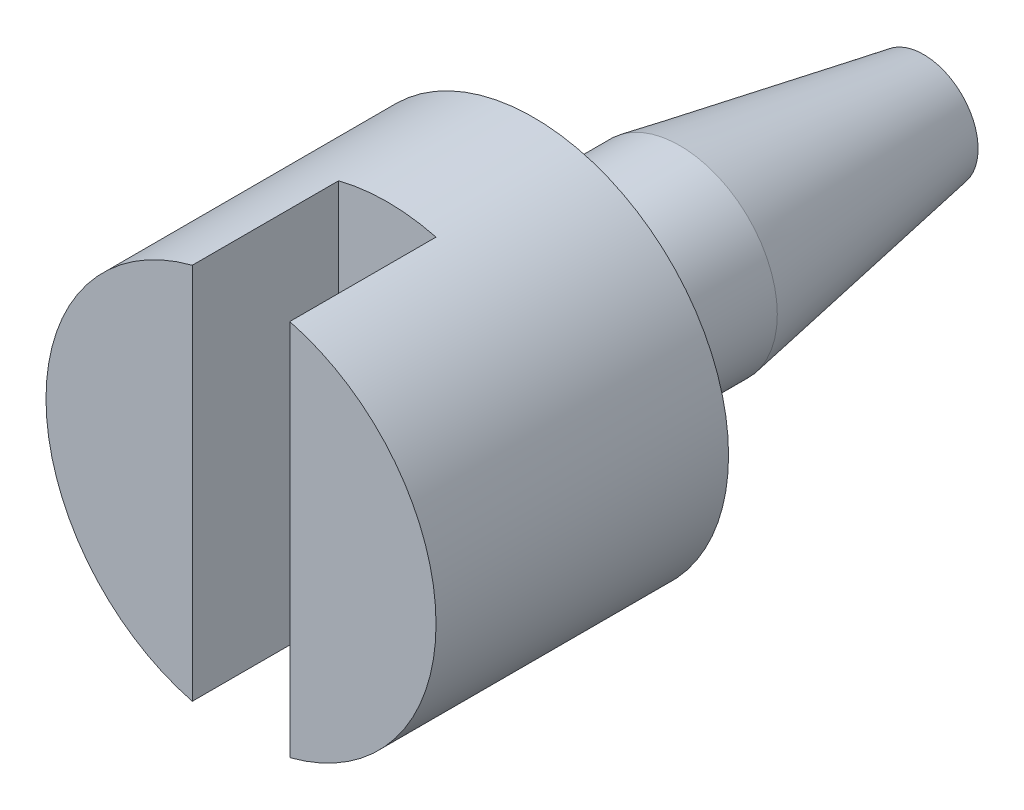
ISO-10303-21;
HEADER;
FILE_DESCRIPTION(('STEP AP214'),'2;1');
FILE_NAME('part.step','',(''),(''),'','','');
FILE_SCHEMA(('AUTOMOTIVE_DESIGN { 1 0 10303 214 1 1 1 1 }'));
ENDSEC;
DATA;
#1=APPLICATION_CONTEXT('core data for automotive mechanical design processes');
#2=APPLICATION_PROTOCOL_DEFINITION('international standard','automotive_design',2000,#1);
#3=PRODUCT_CONTEXT('',#1,'mechanical');
#4=PRODUCT('Part','Part','',(#3));
#5=PRODUCT_RELATED_PRODUCT_CATEGORY('part','',(#4));
#6=PRODUCT_DEFINITION_FORMATION('','',#4);
#7=PRODUCT_DEFINITION_CONTEXT('part definition',#1,'design');
#8=PRODUCT_DEFINITION('design','',#6,#7);
#9=PRODUCT_DEFINITION_SHAPE('','',#8);
#10=(LENGTH_UNIT() NAMED_UNIT(*) SI_UNIT(.MILLI.,.METRE.));
#11=(NAMED_UNIT(*) PLANE_ANGLE_UNIT() SI_UNIT($,.RADIAN.));
#12=(NAMED_UNIT(*) SI_UNIT($,.STERADIAN.) SOLID_ANGLE_UNIT());
#13=UNCERTAINTY_MEASURE_WITH_UNIT(LENGTH_MEASURE(1.E-05),#10,'distance_accuracy_value','');
#14=(GEOMETRIC_REPRESENTATION_CONTEXT(3) GLOBAL_UNCERTAINTY_ASSIGNED_CONTEXT((#13)) GLOBAL_UNIT_ASSIGNED_CONTEXT((#10,
#11,#12)) REPRESENTATION_CONTEXT('',''));
#15=CARTESIAN_POINT('',(0.,0.,0.));
#16=DIRECTION('',(0.,0.,1.));
#17=DIRECTION('',(1.,0.,0.));
#18=AXIS2_PLACEMENT_3D('',#15,#16,#17);
#19=CARTESIAN_POINT('',(0.,0.,3.));
#20=DIRECTION('',(0.,0.,1.));
#21=DIRECTION('',(1.,0.,0.));
#22=AXIS2_PLACEMENT_3D('',#19,#20,#21);
#23=PLANE('',#22);
#24=CARTESIAN_POINT('',(0.,0.,3.));
#25=DIRECTION('',(0.,0.,1.));
#26=DIRECTION('',(1.,0.,0.));
#27=AXIS2_PLACEMENT_3D('',#24,#25,#26);
#28=CIRCLE('',#27,2.);
#29=CARTESIAN_POINT('',(0.5,-1.93649167310371,3.));
#30=VERTEX_POINT('',#29);
#31=CARTESIAN_POINT('',(0.5,1.93649167310371,3.));
#32=VERTEX_POINT('',#31);
#33=EDGE_CURVE('E88',#30,#32,#28,.T.);
#34=ORIENTED_EDGE('',*,*,#33,.T.);
#35=DIRECTION('',(0.,-1.,0.));
#36=VECTOR('',#35,1.);
#37=CARTESIAN_POINT('',(0.5,0.,3.));
#38=LINE('',#37,#36);
#39=EDGE_CURVE('E73',#32,#30,#38,.T.);
#40=ORIENTED_EDGE('',*,*,#39,.T.);
#41=EDGE_LOOP('',(#34,#40));
#42=FACE_BOUND('',#41,.T.);
#43=ADVANCED_FACE('F34',(#42),#23,.T.);
#44=CARTESIAN_POINT('',(0.,0.,0.));
#45=DIRECTION('',(0.,0.,1.));
#46=DIRECTION('',(1.,0.,0.));
#47=AXIS2_PLACEMENT_3D('',#44,#45,#46);
#48=PLANE('',#47);
#49=CARTESIAN_POINT('',(0.,0.,0.));
#50=DIRECTION('',(0.,0.,1.));
#51=DIRECTION('',(1.,0.,0.));
#52=AXIS2_PLACEMENT_3D('',#49,#50,#51);
#53=CIRCLE('',#52,2.);
#54=CARTESIAN_POINT('',(2.,0.,0.));
#55=VERTEX_POINT('',#54);
#56=EDGE_CURVE('E92',#55,#55,#53,.T.);
#57=ORIENTED_EDGE('',*,*,#56,.F.);
#58=EDGE_LOOP('',(#57));
#59=FACE_BOUND('',#58,.T.);
#60=CARTESIAN_POINT('',(0.,0.,0.));
#61=DIRECTION('',(0.,0.,1.));
#62=DIRECTION('',(1.,0.,0.));
#63=AXIS2_PLACEMENT_3D('',#60,#61,#62);
#64=CIRCLE('',#63,1.);
#65=CARTESIAN_POINT('',(1.,0.,0.));
#66=VERTEX_POINT('',#65);
#67=EDGE_CURVE('E95',#66,#66,#64,.F.);
#68=ORIENTED_EDGE('',*,*,#67,.F.);
#69=EDGE_LOOP('',(#68));
#70=FACE_BOUND('',#69,.T.);
#71=ADVANCED_FACE('F129',(#59,#70),#48,.F.);
#72=CARTESIAN_POINT('',(0.,0.,3.));
#73=DIRECTION('',(0.,0.,-1.));
#74=DIRECTION('',(-1.,0.,0.));
#75=AXIS2_PLACEMENT_3D('',#72,#73,#74);
#76=CYLINDRICAL_SURFACE('',#75,2.);
#77=CARTESIAN_POINT('',(-0.5,1.93649167310371,3.));
#78=VERTEX_POINT('',#77);
#79=CARTESIAN_POINT('',(-0.5,-1.93649167310371,3.));
#80=VERTEX_POINT('',#79);
#81=EDGE_CURVE('E91',#78,#80,#28,.T.);
#82=ORIENTED_EDGE('',*,*,#81,.F.);
#83=DIRECTION('',(0.,0.,-1.));
#84=VECTOR('',#83,1.);
#85=CARTESIAN_POINT('',(-0.5,1.93649167310371,3.));
#86=LINE('',#85,#84);
#87=CARTESIAN_POINT('',(-0.5,1.93649167310371,1.5));
#88=VERTEX_POINT('',#87);
#89=EDGE_CURVE('E97',#78,#88,#86,.T.);
#90=ORIENTED_EDGE('',*,*,#89,.T.);
#91=CARTESIAN_POINT('',(0.,0.,1.5));
#92=DIRECTION('',(0.,0.,1.));
#93=DIRECTION('',(1.,0.,0.));
#94=AXIS2_PLACEMENT_3D('',#91,#92,#93);
#95=CIRCLE('',#94,2.);
#96=CARTESIAN_POINT('',(0.5,1.93649167310371,1.5));
#97=VERTEX_POINT('',#96);
#98=EDGE_CURVE('E11',#97,#88,#95,.T.);
#99=ORIENTED_EDGE('',*,*,#98,.F.);
#100=DIRECTION('',(0.,0.,-1.));
#101=VECTOR('',#100,1.);
#102=CARTESIAN_POINT('',(0.5,1.93649167310371,3.));
#103=LINE('',#102,#101);
#104=EDGE_CURVE('E76',#32,#97,#103,.T.);
#105=ORIENTED_EDGE('',*,*,#104,.F.);
#106=ORIENTED_EDGE('',*,*,#33,.F.);
#107=DIRECTION('',(0.,0.,-1.));
#108=VECTOR('',#107,1.);
#109=CARTESIAN_POINT('',(0.5,-1.93649167310371,3.));
#110=LINE('',#109,#108);
#111=CARTESIAN_POINT('',(0.5,-1.93649167310371,1.5));
#112=VERTEX_POINT('',#111);
#113=EDGE_CURVE('E49',#112,#30,#110,.F.);
#114=ORIENTED_EDGE('',*,*,#113,.F.);
#115=CARTESIAN_POINT('',(-0.5,-1.93649167310371,1.5));
#116=VERTEX_POINT('',#115);
#117=EDGE_CURVE('E38',#116,#112,#95,.T.);
#118=ORIENTED_EDGE('',*,*,#117,.F.);
#119=DIRECTION('',(0.,0.,-1.));
#120=VECTOR('',#119,1.);
#121=CARTESIAN_POINT('',(-0.5,-1.93649167310371,3.));
#122=LINE('',#121,#120);
#123=EDGE_CURVE('E57',#116,#80,#122,.F.);
#124=ORIENTED_EDGE('',*,*,#123,.T.);
#125=EDGE_LOOP('',(#82,#90,#99,#105,#106,#114,#118,#124));
#126=FACE_BOUND('',#125,.T.);
#127=ORIENTED_EDGE('',*,*,#56,.T.);
#128=EDGE_LOOP('',(#127));
#129=FACE_BOUND('',#128,.T.);
#130=ADVANCED_FACE('F36',(#126,#129),#76,.T.);
#131=DIRECTION('',(0.,-1.,0.));
#132=VECTOR('',#131,1.);
#133=CARTESIAN_POINT('',(-0.5,0.,3.));
#134=LINE('',#133,#132);
#135=EDGE_CURVE('E81',#78,#80,#134,.T.);
#136=ORIENTED_EDGE('',*,*,#135,.F.);
#137=ORIENTED_EDGE('',*,*,#81,.T.);
#138=EDGE_LOOP('',(#136,#137));
#139=FACE_BOUND('',#138,.T.);
#140=ADVANCED_FACE('F119',(#139),#23,.T.);
#141=CARTESIAN_POINT('',(0.,0.,-4.));
#142=DIRECTION('',(0.,0.,1.));
#143=DIRECTION('',(1.,0.,0.));
#144=AXIS2_PLACEMENT_3D('',#141,#142,#143);
#145=CYLINDRICAL_SURFACE('',#144,1.);
#146=CARTESIAN_POINT('',(0.,0.,-1.49999999999994));
#147=DIRECTION('',(0.,0.,-1.));
#148=DIRECTION('',(-1.,0.,0.));
#149=AXIS2_PLACEMENT_3D('',#146,#147,#148);
#150=CIRCLE('',#149,1.);
#151=CARTESIAN_POINT('',(-1.,0.,-1.49999999999994));
#152=VERTEX_POINT('',#151);
#153=EDGE_CURVE('E82',#152,#152,#150,.F.);
#154=ORIENTED_EDGE('',*,*,#153,.T.);
#155=EDGE_LOOP('',(#154));
#156=FACE_BOUND('',#155,.T.);
#157=ORIENTED_EDGE('',*,*,#67,.T.);
#158=EDGE_LOOP('',(#157));
#159=FACE_BOUND('',#158,.T.);
#160=ADVANCED_FACE('F121',(#156,#159),#145,.T.);
#161=CARTESIAN_POINT('',(0.,0.,-4.));
#162=DIRECTION('',(0.,0.,-1.));
#163=DIRECTION('',(-1.,0.,0.));
#164=AXIS2_PLACEMENT_3D('',#161,#162,#163);
#165=PLANE('',#164);
#166=CARTESIAN_POINT('',(0.,0.,-4.));
#167=DIRECTION('',(0.,0.,-1.));
#168=DIRECTION('',(-1.,0.,0.));
#169=AXIS2_PLACEMENT_3D('',#166,#167,#168);
#170=CIRCLE('',#169,0.559182548228836);
#171=CARTESIAN_POINT('',(-0.559182548228836,0.,-4.));
#172=VERTEX_POINT('',#171);
#173=EDGE_CURVE('E103',#172,#172,#170,.T.);
#174=ORIENTED_EDGE('',*,*,#173,.T.);
#175=EDGE_LOOP('',(#174));
#176=FACE_BOUND('',#175,.T.);
#177=ADVANCED_FACE('F126',(#176),#165,.T.);
#178=CARTESIAN_POINT('',(0.,0.,-4.));
#179=DIRECTION('',(0.,0.,1.));
#180=DIRECTION('',(1.,0.,0.));
#181=AXIS2_PLACEMENT_3D('',#178,#179,#180);
#182=CONICAL_SURFACE('',#181,0.559182548228836,0.17453292519943);
#183=ORIENTED_EDGE('',*,*,#153,.F.);
#184=EDGE_LOOP('',(#183));
#185=FACE_BOUND('',#184,.T.);
#186=ORIENTED_EDGE('',*,*,#173,.F.);
#187=EDGE_LOOP('',(#186));
#188=FACE_BOUND('',#187,.T.);
#189=ADVANCED_FACE('F143',(#185,#188),#182,.T.);
#190=CARTESIAN_POINT('',(-0.5,-2.42872408073892,1.5));
#191=DIRECTION('',(0.,0.,1.));
#192=DIRECTION('',(1.,0.,0.));
#193=AXIS2_PLACEMENT_3D('',#190,#191,#192);
#194=PLANE('',#193);
#195=ORIENTED_EDGE('',*,*,#98,.T.);
#196=DIRECTION('',(0.,1.,0.));
#197=VECTOR('',#196,1.);
#198=CARTESIAN_POINT('',(-0.5,2.26142479726765,1.5));
#199=LINE('',#198,#197);
#200=EDGE_CURVE('E112',#88,#116,#199,.F.);
#201=ORIENTED_EDGE('',*,*,#200,.T.);
#202=ORIENTED_EDGE('',*,*,#117,.T.);
#203=DIRECTION('',(0.,1.,0.));
#204=VECTOR('',#203,1.);
#205=CARTESIAN_POINT('',(0.5,2.26142479726765,1.5));
#206=LINE('',#205,#204);
#207=EDGE_CURVE('E111',#97,#112,#206,.F.);
#208=ORIENTED_EDGE('',*,*,#207,.F.);
#209=EDGE_LOOP('',(#195,#201,#202,#208));
#210=FACE_BOUND('',#209,.T.);
#211=ADVANCED_FACE('F110',(#210),#194,.T.);
#212=CARTESIAN_POINT('',(-0.5,2.26142479726765,1.5));
#213=DIRECTION('',(-1.,0.,0.));
#214=DIRECTION('',(0.,0.,1.));
#215=AXIS2_PLACEMENT_3D('',#212,#213,#214);
#216=PLANE('',#215);
#217=ORIENTED_EDGE('',*,*,#135,.T.);
#218=ORIENTED_EDGE('',*,*,#123,.F.);
#219=ORIENTED_EDGE('',*,*,#200,.F.);
#220=ORIENTED_EDGE('',*,*,#89,.F.);
#221=EDGE_LOOP('',(#217,#218,#219,#220));
#222=FACE_BOUND('',#221,.T.);
#223=ADVANCED_FACE('F117',(#222),#216,.F.);
#224=CARTESIAN_POINT('',(0.5,2.26142479726765,1.5));
#225=DIRECTION('',(-1.,0.,0.));
#226=DIRECTION('',(0.,0.,1.));
#227=AXIS2_PLACEMENT_3D('',#224,#225,#226);
#228=PLANE('',#227);
#229=ORIENTED_EDGE('',*,*,#104,.T.);
#230=ORIENTED_EDGE('',*,*,#207,.T.);
#231=ORIENTED_EDGE('',*,*,#113,.T.);
#232=ORIENTED_EDGE('',*,*,#39,.F.);
#233=EDGE_LOOP('',(#229,#230,#231,#232));
#234=FACE_BOUND('',#233,.T.);
#235=ADVANCED_FACE('F75',(#234),#228,.T.);
#236=CLOSED_SHELL('',(#43,#71,#130,#140,#160,#177,#189,#211,#223,#235));
#237=MANIFOLD_SOLID_BREP('B2',#236);
#238=ADVANCED_BREP_SHAPE_REPRESENTATION('',(#18,#237),#14);
#239=SHAPE_DEFINITION_REPRESENTATION(#9,#238);
ENDSEC;
END-ISO-10303-21;
